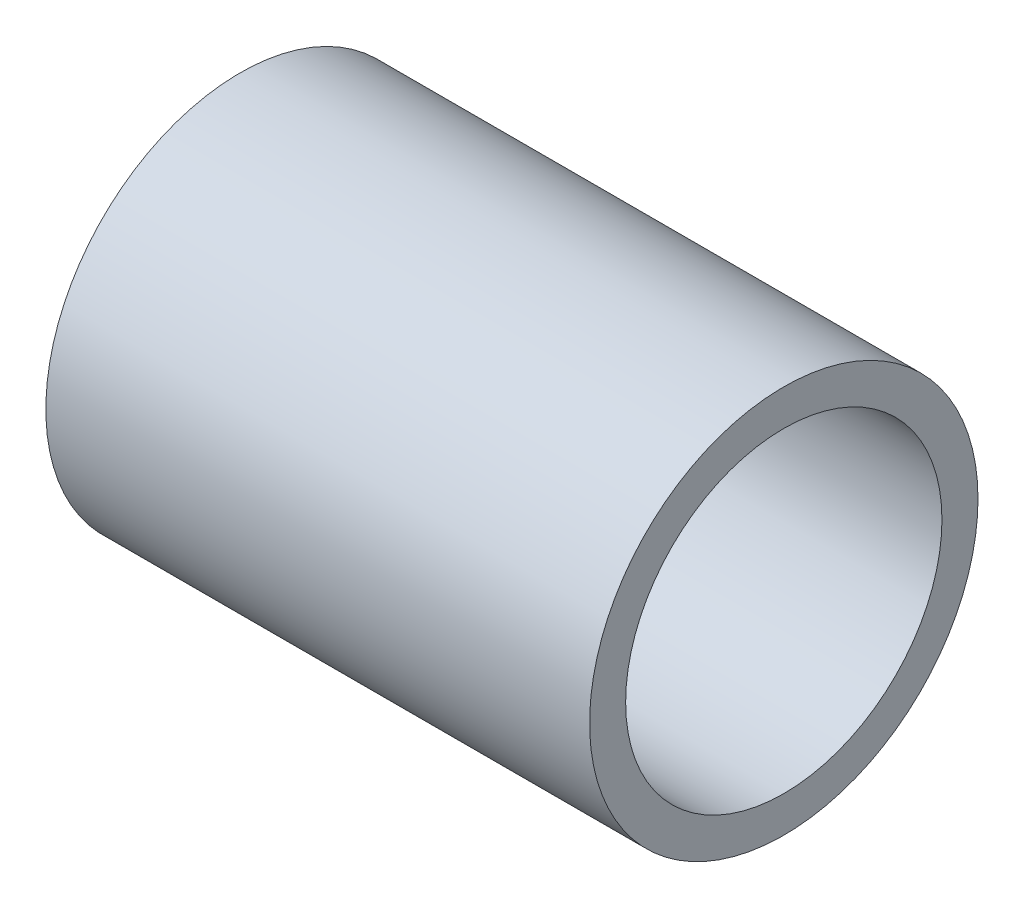
ISO-10303-21;
HEADER;
FILE_DESCRIPTION(('STEP AP214'),'2;1');
FILE_NAME('part.step','',(''),(''),'','','');
FILE_SCHEMA(('AUTOMOTIVE_DESIGN { 1 0 10303 214 1 1 1 1 }'));
ENDSEC;
DATA;
#1=APPLICATION_CONTEXT('core data for automotive mechanical design processes');
#2=APPLICATION_PROTOCOL_DEFINITION('international standard','automotive_design',2000,#1);
#3=PRODUCT_CONTEXT('',#1,'mechanical');
#4=PRODUCT('Part','Part','',(#3));
#5=PRODUCT_RELATED_PRODUCT_CATEGORY('part','',(#4));
#6=PRODUCT_DEFINITION_FORMATION('','',#4);
#7=PRODUCT_DEFINITION_CONTEXT('part definition',#1,'design');
#8=PRODUCT_DEFINITION('design','',#6,#7);
#9=PRODUCT_DEFINITION_SHAPE('','',#8);
#10=(LENGTH_UNIT() NAMED_UNIT(*) SI_UNIT(.MILLI.,.METRE.));
#11=(NAMED_UNIT(*) PLANE_ANGLE_UNIT() SI_UNIT($,.RADIAN.));
#12=(NAMED_UNIT(*) SI_UNIT($,.STERADIAN.) SOLID_ANGLE_UNIT());
#13=UNCERTAINTY_MEASURE_WITH_UNIT(LENGTH_MEASURE(1.E-05),#10,'distance_accuracy_value','');
#14=(GEOMETRIC_REPRESENTATION_CONTEXT(3) GLOBAL_UNCERTAINTY_ASSIGNED_CONTEXT((#13)) GLOBAL_UNIT_ASSIGNED_CONTEXT((#10,
#11,#12)) REPRESENTATION_CONTEXT('',''));
#15=CARTESIAN_POINT('',(0.,0.,0.));
#16=DIRECTION('',(0.,0.,1.));
#17=DIRECTION('',(1.,0.,0.));
#18=AXIS2_PLACEMENT_3D('',#15,#16,#17);
#19=CARTESIAN_POINT('',(22.225,0.,0.));
#20=DIRECTION('',(1.,0.,0.));
#21=DIRECTION('',(0.,0.,-1.));
#22=AXIS2_PLACEMENT_3D('',#19,#20,#21);
#23=PLANE('',#22);
#24=CARTESIAN_POINT('',(22.225,0.,0.));
#25=DIRECTION('',(1.,0.,0.));
#26=DIRECTION('',(0.,0.,-1.));
#27=AXIS2_PLACEMENT_3D('',#24,#25,#26);
#28=CIRCLE('',#27,7.9375);
#29=CARTESIAN_POINT('',(22.225,0.,-7.9375));
#30=VERTEX_POINT('',#29);
#31=EDGE_CURVE('E10',#30,#30,#28,.T.);
#32=ORIENTED_EDGE('',*,*,#31,.T.);
#33=EDGE_LOOP('',(#32));
#34=FACE_BOUND('',#33,.T.);
#35=CARTESIAN_POINT('',(22.225,0.,0.));
#36=DIRECTION('',(1.,0.,0.));
#37=DIRECTION('',(0.,0.,-1.));
#38=AXIS2_PLACEMENT_3D('',#35,#36,#37);
#39=CIRCLE('',#38,6.4643);
#40=CARTESIAN_POINT('',(22.225,0.,-6.4643));
#41=VERTEX_POINT('',#40);
#42=EDGE_CURVE('E39',#41,#41,#39,.T.);
#43=ORIENTED_EDGE('',*,*,#42,.F.);
#44=EDGE_LOOP('',(#43));
#45=FACE_BOUND('',#44,.T.);
#46=ADVANCED_FACE('F28',(#34,#45),#23,.T.);
#47=CARTESIAN_POINT('',(0.,0.,0.));
#48=DIRECTION('',(1.,0.,0.));
#49=DIRECTION('',(0.,0.,-1.));
#50=AXIS2_PLACEMENT_3D('',#47,#48,#49);
#51=PLANE('',#50);
#52=CARTESIAN_POINT('',(0.,0.,0.));
#53=DIRECTION('',(1.,0.,0.));
#54=DIRECTION('',(0.,0.,-1.));
#55=AXIS2_PLACEMENT_3D('',#52,#53,#54);
#56=CIRCLE('',#55,7.9375);
#57=CARTESIAN_POINT('',(0.,0.,-7.9375));
#58=VERTEX_POINT('',#57);
#59=EDGE_CURVE('E32',#58,#58,#56,.T.);
#60=ORIENTED_EDGE('',*,*,#59,.F.);
#61=EDGE_LOOP('',(#60));
#62=FACE_BOUND('',#61,.T.);
#63=CARTESIAN_POINT('',(0.,0.,0.));
#64=DIRECTION('',(1.,0.,0.));
#65=DIRECTION('',(0.,0.,-1.));
#66=AXIS2_PLACEMENT_3D('',#63,#64,#65);
#67=CIRCLE('',#66,6.4643);
#68=CARTESIAN_POINT('',(0.,0.,-6.4643));
#69=VERTEX_POINT('',#68);
#70=EDGE_CURVE('E41',#69,#69,#67,.T.);
#71=ORIENTED_EDGE('',*,*,#70,.T.);
#72=EDGE_LOOP('',(#71));
#73=FACE_BOUND('',#72,.T.);
#74=ADVANCED_FACE('F51',(#62,#73),#51,.F.);
#75=CARTESIAN_POINT('',(22.225,0.,0.));
#76=DIRECTION('',(-1.,0.,0.));
#77=DIRECTION('',(0.,0.,1.));
#78=AXIS2_PLACEMENT_3D('',#75,#76,#77);
#79=CYLINDRICAL_SURFACE('',#78,7.9375);
#80=ORIENTED_EDGE('',*,*,#31,.F.);
#81=EDGE_LOOP('',(#80));
#82=FACE_BOUND('',#81,.T.);
#83=ORIENTED_EDGE('',*,*,#59,.T.);
#84=EDGE_LOOP('',(#83));
#85=FACE_BOUND('',#84,.T.);
#86=ADVANCED_FACE('F30',(#82,#85),#79,.T.);
#87=CARTESIAN_POINT('',(22.225,0.,0.));
#88=DIRECTION('',(-1.,0.,0.));
#89=DIRECTION('',(0.,0.,1.));
#90=AXIS2_PLACEMENT_3D('',#87,#88,#89);
#91=CYLINDRICAL_SURFACE('',#90,6.4643);
#92=ORIENTED_EDGE('',*,*,#42,.T.);
#93=EDGE_LOOP('',(#92));
#94=FACE_BOUND('',#93,.T.);
#95=ORIENTED_EDGE('',*,*,#70,.F.);
#96=EDGE_LOOP('',(#95));
#97=FACE_BOUND('',#96,.T.);
#98=ADVANCED_FACE('F47',(#94,#97),#91,.F.);
#99=CLOSED_SHELL('',(#46,#74,#86,#98));
#100=MANIFOLD_SOLID_BREP('B2',#99);
#101=ADVANCED_BREP_SHAPE_REPRESENTATION('',(#18,#100),#14);
#102=SHAPE_DEFINITION_REPRESENTATION(#9,#101);
ENDSEC;
END-ISO-10303-21;
